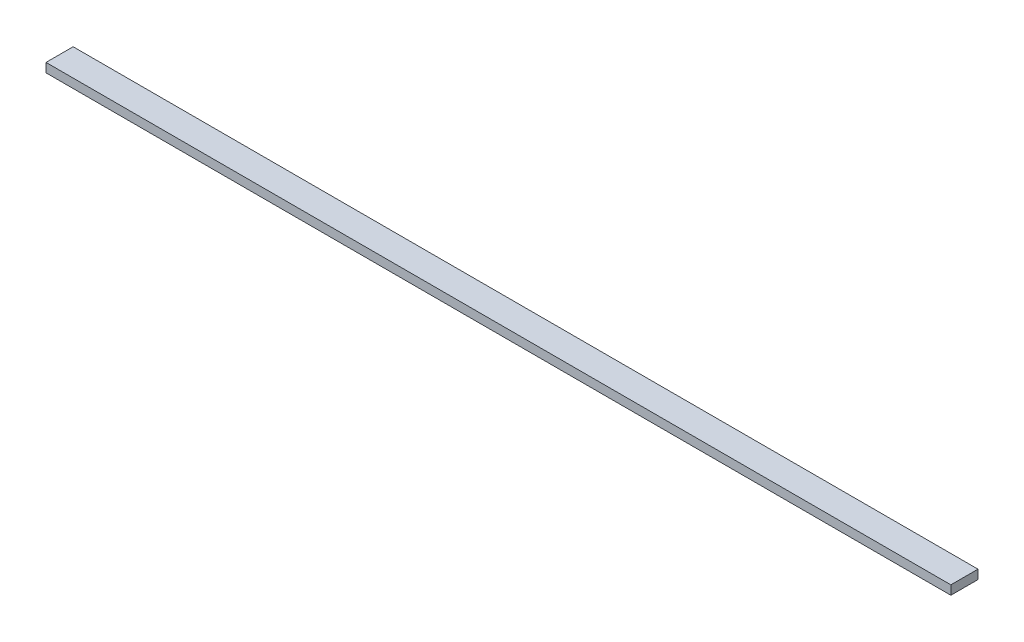
ISO-10303-21;
HEADER;
FILE_DESCRIPTION(('STEP AP214'),'2;1');
FILE_NAME('part.step','',(''),(''),'','','');
FILE_SCHEMA(('AUTOMOTIVE_DESIGN { 1 0 10303 214 1 1 1 1 }'));
ENDSEC;
DATA;
#1=APPLICATION_CONTEXT('core data for automotive mechanical design processes');
#2=APPLICATION_PROTOCOL_DEFINITION('international standard','automotive_design',2000,#1);
#3=PRODUCT_CONTEXT('',#1,'mechanical');
#4=PRODUCT('Part','Part','',(#3));
#5=PRODUCT_RELATED_PRODUCT_CATEGORY('part','',(#4));
#6=PRODUCT_DEFINITION_FORMATION('','',#4);
#7=PRODUCT_DEFINITION_CONTEXT('part definition',#1,'design');
#8=PRODUCT_DEFINITION('design','',#6,#7);
#9=PRODUCT_DEFINITION_SHAPE('','',#8);
#10=(LENGTH_UNIT() NAMED_UNIT(*) SI_UNIT(.MILLI.,.METRE.));
#11=(NAMED_UNIT(*) PLANE_ANGLE_UNIT() SI_UNIT($,.RADIAN.));
#12=(NAMED_UNIT(*) SI_UNIT($,.STERADIAN.) SOLID_ANGLE_UNIT());
#13=UNCERTAINTY_MEASURE_WITH_UNIT(LENGTH_MEASURE(1.E-05),#10,'distance_accuracy_value','');
#14=(GEOMETRIC_REPRESENTATION_CONTEXT(3) GLOBAL_UNCERTAINTY_ASSIGNED_CONTEXT((#13)) GLOBAL_UNIT_ASSIGNED_CONTEXT((#10,
#11,#12)) REPRESENTATION_CONTEXT('',''));
#15=CARTESIAN_POINT('',(0.,0.,0.));
#16=DIRECTION('',(0.,0.,1.));
#17=DIRECTION('',(1.,0.,0.));
#18=AXIS2_PLACEMENT_3D('',#15,#16,#17);
#19=CARTESIAN_POINT('',(1755.05617977528,106.966292134831,5140.));
#20=DIRECTION('',(-1.,0.,0.));
#21=DIRECTION('',(0.,0.,1.));
#22=AXIS2_PLACEMENT_3D('',#19,#20,#21);
#23=PLANE('',#22);
#24=DIRECTION('',(0.,1.,0.));
#25=VECTOR('',#24,1.);
#26=CARTESIAN_POINT('',(1755.05617977528,0.,5200.));
#27=LINE('',#26,#25);
#28=CARTESIAN_POINT('',(1755.05617977528,106.966292134831,5200.));
#29=VERTEX_POINT('',#28);
#30=CARTESIAN_POINT('',(1755.05617977528,126.966292134832,5200.));
#31=VERTEX_POINT('',#30);
#32=EDGE_CURVE('E90',#29,#31,#27,.T.);
#33=ORIENTED_EDGE('',*,*,#32,.F.);
#34=DIRECTION('',(0.,0.,-1.));
#35=VECTOR('',#34,1.);
#36=CARTESIAN_POINT('',(1755.05617977528,106.966292134831,5200.));
#37=LINE('',#36,#35);
#38=CARTESIAN_POINT('',(1755.05617977528,106.966292134831,5140.));
#39=VERTEX_POINT('',#38);
#40=EDGE_CURVE('E37',#29,#39,#37,.T.);
#41=ORIENTED_EDGE('',*,*,#40,.T.);
#42=DIRECTION('',(0.,1.,0.));
#43=VECTOR('',#42,1.);
#44=CARTESIAN_POINT('',(1755.05617977528,126.966292134831,5140.));
#45=LINE('',#44,#43);
#46=CARTESIAN_POINT('',(1755.05617977528,126.966292134831,5140.));
#47=VERTEX_POINT('',#46);
#48=EDGE_CURVE('E89',#39,#47,#45,.T.);
#49=ORIENTED_EDGE('',*,*,#48,.T.);
#50=DIRECTION('',(0.,0.,-1.));
#51=VECTOR('',#50,1.);
#52=CARTESIAN_POINT('',(1755.05617977528,126.966292134832,5200.));
#53=LINE('',#52,#51);
#54=EDGE_CURVE('E70',#31,#47,#53,.T.);
#55=ORIENTED_EDGE('',*,*,#54,.F.);
#56=EDGE_LOOP('',(#33,#41,#49,#55));
#57=FACE_BOUND('',#56,.T.);
#58=ADVANCED_FACE('F34',(#57),#23,.F.);
#59=CARTESIAN_POINT('',(-244.943820224719,106.966292134832,5200.));
#60=DIRECTION('',(1.,0.,0.));
#61=DIRECTION('',(0.,1.,0.));
#62=AXIS2_PLACEMENT_3D('',#59,#60,#61);
#63=PLANE('',#62);
#64=DIRECTION('',(0.,0.,1.));
#65=VECTOR('',#64,1.);
#66=CARTESIAN_POINT('',(-244.943820224719,126.966292134832,5200.));
#67=LINE('',#66,#65);
#68=CARTESIAN_POINT('',(-244.943820224719,126.966292134832,5140.));
#69=VERTEX_POINT('',#68);
#70=CARTESIAN_POINT('',(-244.943820224719,126.966292134832,5200.));
#71=VERTEX_POINT('',#70);
#72=EDGE_CURVE('E94',#69,#71,#67,.T.);
#73=ORIENTED_EDGE('',*,*,#72,.F.);
#74=DIRECTION('',(0.,1.,0.));
#75=VECTOR('',#74,1.);
#76=CARTESIAN_POINT('',(-244.943820224719,126.966292134832,5140.));
#77=LINE('',#76,#75);
#78=CARTESIAN_POINT('',(-244.943820224719,106.966292134832,5140.));
#79=VERTEX_POINT('',#78);
#80=EDGE_CURVE('E51',#79,#69,#77,.T.);
#81=ORIENTED_EDGE('',*,*,#80,.F.);
#82=DIRECTION('',(0.,0.,-1.));
#83=VECTOR('',#82,1.);
#84=CARTESIAN_POINT('',(-244.943820224719,106.966292134832,5200.));
#85=LINE('',#84,#83);
#86=CARTESIAN_POINT('',(-244.943820224719,106.966292134832,5200.));
#87=VERTEX_POINT('',#86);
#88=EDGE_CURVE('E63',#87,#79,#85,.T.);
#89=ORIENTED_EDGE('',*,*,#88,.F.);
#90=DIRECTION('',(0.,-1.,0.));
#91=VECTOR('',#90,1.);
#92=CARTESIAN_POINT('',(-244.943820224719,0.,5200.));
#93=LINE('',#92,#91);
#94=EDGE_CURVE('E75',#71,#87,#93,.T.);
#95=ORIENTED_EDGE('',*,*,#94,.F.);
#96=EDGE_LOOP('',(#73,#81,#89,#95));
#97=FACE_BOUND('',#96,.T.);
#98=ADVANCED_FACE('F107',(#97),#63,.F.);
#99=CARTESIAN_POINT('',(0.,0.,5200.));
#100=DIRECTION('',(0.,0.,-1.));
#101=DIRECTION('',(-1.,0.,0.));
#102=AXIS2_PLACEMENT_3D('',#99,#100,#101);
#103=PLANE('',#102);
#104=DIRECTION('',(-1.,0.,0.));
#105=VECTOR('',#104,1.);
#106=CARTESIAN_POINT('',(1818.30173297865,106.966292134831,5200.));
#107=LINE('',#106,#105);
#108=EDGE_CURVE('E87',#29,#87,#107,.T.);
#109=ORIENTED_EDGE('',*,*,#108,.F.);
#110=ORIENTED_EDGE('',*,*,#32,.T.);
#111=DIRECTION('',(-1.,0.,0.));
#112=VECTOR('',#111,1.);
#113=CARTESIAN_POINT('',(1755.05617977528,126.966292134832,5200.));
#114=LINE('',#113,#112);
#115=EDGE_CURVE('E43',#31,#71,#114,.T.);
#116=ORIENTED_EDGE('',*,*,#115,.T.);
#117=ORIENTED_EDGE('',*,*,#94,.T.);
#118=EDGE_LOOP('',(#109,#110,#116,#117));
#119=FACE_BOUND('',#118,.T.);
#120=ADVANCED_FACE('F96',(#119),#103,.F.);
#121=CARTESIAN_POINT('',(-294.943820224719,126.966292134832,5200.));
#122=DIRECTION('',(0.,-1.,0.));
#123=DIRECTION('',(0.,0.,-1.));
#124=AXIS2_PLACEMENT_3D('',#121,#122,#123);
#125=PLANE('',#124);
#126=ORIENTED_EDGE('',*,*,#115,.F.);
#127=ORIENTED_EDGE('',*,*,#54,.T.);
#128=DIRECTION('',(-1.,0.,0.));
#129=VECTOR('',#128,1.);
#130=CARTESIAN_POINT('',(1818.30173297865,126.966292134831,5140.));
#131=LINE('',#130,#129);
#132=EDGE_CURVE('E11',#47,#69,#131,.T.);
#133=ORIENTED_EDGE('',*,*,#132,.T.);
#134=ORIENTED_EDGE('',*,*,#72,.T.);
#135=EDGE_LOOP('',(#126,#127,#133,#134));
#136=FACE_BOUND('',#135,.T.);
#137=ADVANCED_FACE('F106',(#136),#125,.F.);
#138=CARTESIAN_POINT('',(1818.30173297865,106.966292134831,5200.));
#139=DIRECTION('',(0.,1.,0.));
#140=DIRECTION('',(-1.,0.,0.));
#141=AXIS2_PLACEMENT_3D('',#138,#139,#140);
#142=PLANE('',#141);
#143=ORIENTED_EDGE('',*,*,#40,.F.);
#144=ORIENTED_EDGE('',*,*,#108,.T.);
#145=ORIENTED_EDGE('',*,*,#88,.T.);
#146=DIRECTION('',(-1.,0.,0.));
#147=VECTOR('',#146,1.);
#148=CARTESIAN_POINT('',(1818.30173297865,106.966292134831,5140.));
#149=LINE('',#148,#147);
#150=EDGE_CURVE('E88',#39,#79,#149,.T.);
#151=ORIENTED_EDGE('',*,*,#150,.F.);
#152=EDGE_LOOP('',(#143,#144,#145,#151));
#153=FACE_BOUND('',#152,.T.);
#154=ADVANCED_FACE('F85',(#153),#142,.F.);
#155=CARTESIAN_POINT('',(1818.30173297865,126.966292134831,5140.));
#156=DIRECTION('',(0.,0.,1.));
#157=DIRECTION('',(1.,0.,0.));
#158=AXIS2_PLACEMENT_3D('',#155,#156,#157);
#159=PLANE('',#158);
#160=ORIENTED_EDGE('',*,*,#48,.F.);
#161=ORIENTED_EDGE('',*,*,#150,.T.);
#162=ORIENTED_EDGE('',*,*,#80,.T.);
#163=ORIENTED_EDGE('',*,*,#132,.F.);
#164=EDGE_LOOP('',(#160,#161,#162,#163));
#165=FACE_BOUND('',#164,.T.);
#166=ADVANCED_FACE('F108',(#165),#159,.F.);
#167=CLOSED_SHELL('',(#58,#98,#120,#137,#154,#166));
#168=MANIFOLD_SOLID_BREP('B2',#167);
#169=ADVANCED_BREP_SHAPE_REPRESENTATION('',(#18,#168),#14);
#170=SHAPE_DEFINITION_REPRESENTATION(#9,#169);
ENDSEC;
END-ISO-10303-21;
